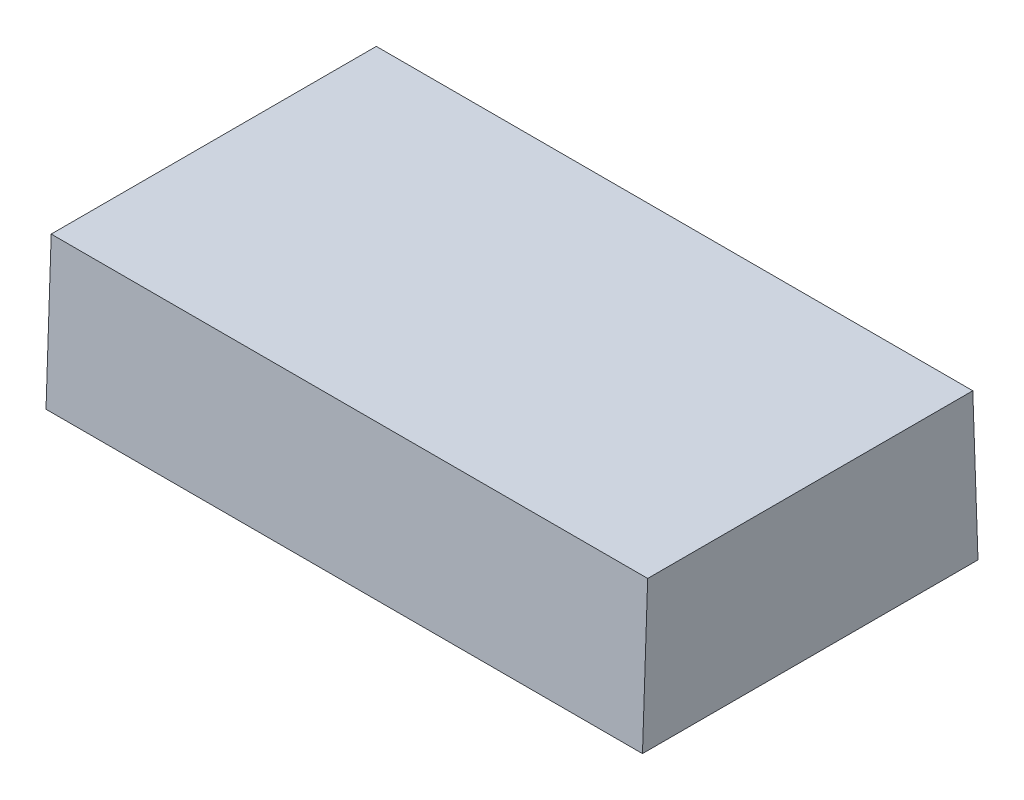
ISO-10303-21;
HEADER;
FILE_DESCRIPTION(('STEP AP214'),'2;1');
FILE_NAME('part.step','',(''),(''),'','','');
FILE_SCHEMA(('AUTOMOTIVE_DESIGN { 1 0 10303 214 1 1 1 1 }'));
ENDSEC;
DATA;
#1=APPLICATION_CONTEXT('core data for automotive mechanical design processes');
#2=APPLICATION_PROTOCOL_DEFINITION('international standard','automotive_design',2000,#1);
#3=PRODUCT_CONTEXT('',#1,'mechanical');
#4=PRODUCT('Part','Part','',(#3));
#5=PRODUCT_RELATED_PRODUCT_CATEGORY('part','',(#4));
#6=PRODUCT_DEFINITION_FORMATION('','',#4);
#7=PRODUCT_DEFINITION_CONTEXT('part definition',#1,'design');
#8=PRODUCT_DEFINITION('design','',#6,#7);
#9=PRODUCT_DEFINITION_SHAPE('','',#8);
#10=(LENGTH_UNIT() NAMED_UNIT(*) SI_UNIT(.MILLI.,.METRE.));
#11=(NAMED_UNIT(*) PLANE_ANGLE_UNIT() SI_UNIT($,.RADIAN.));
#12=(NAMED_UNIT(*) SI_UNIT($,.STERADIAN.) SOLID_ANGLE_UNIT());
#13=UNCERTAINTY_MEASURE_WITH_UNIT(LENGTH_MEASURE(1.E-05),#10,'distance_accuracy_value','');
#14=(GEOMETRIC_REPRESENTATION_CONTEXT(3) GLOBAL_UNCERTAINTY_ASSIGNED_CONTEXT((#13)) GLOBAL_UNIT_ASSIGNED_CONTEXT((#10,
#11,#12)) REPRESENTATION_CONTEXT('',''));
#15=CARTESIAN_POINT('',(0.,0.,0.));
#16=DIRECTION('',(0.,0.,1.));
#17=DIRECTION('',(1.,0.,0.));
#18=AXIS2_PLACEMENT_3D('',#15,#16,#17);
#19=CARTESIAN_POINT('',(203.2,50.8,-1.77397509018057));
#20=DIRECTION('',(0.,-0.0348994967024967,-0.999390827019096));
#21=DIRECTION('',(0.,0.999390827019096,-0.0348994967024967));
#22=AXIS2_PLACEMENT_3D('',#19,#20,#21);
#23=PLANE('',#22);
#24=DIRECTION('',(0.,-0.999390827019096,0.0348994967024967));
#25=VECTOR('',#24,1.);
#26=CARTESIAN_POINT('',(0.,50.8,-1.77397509018057));
#27=LINE('',#26,#25);
#28=CARTESIAN_POINT('',(0.,50.8,-1.77397509018057));
#29=VERTEX_POINT('',#28);
#30=CARTESIAN_POINT('',(0.,0.,0.));
#31=VERTEX_POINT('',#30);
#32=EDGE_CURVE('E142',#29,#31,#27,.T.);
#33=ORIENTED_EDGE('',*,*,#32,.T.);
#34=DIRECTION('',(-1.,0.,0.));
#35=VECTOR('',#34,1.);
#36=CARTESIAN_POINT('',(203.2,0.,0.));
#37=LINE('',#36,#35);
#38=CARTESIAN_POINT('',(203.2,0.,0.));
#39=VERTEX_POINT('',#38);
#40=EDGE_CURVE('E11',#39,#31,#37,.T.);
#41=ORIENTED_EDGE('',*,*,#40,.F.);
#42=DIRECTION('',(0.,-0.999390827019096,0.0348994967024967));
#43=VECTOR('',#42,1.);
#44=CARTESIAN_POINT('',(203.2,50.8,-1.77397509018057));
#45=LINE('',#44,#43);
#46=CARTESIAN_POINT('',(203.2,50.8,-1.77397509018057));
#47=VERTEX_POINT('',#46);
#48=EDGE_CURVE('E154',#47,#39,#45,.T.);
#49=ORIENTED_EDGE('',*,*,#48,.F.);
#50=DIRECTION('',(-1.,0.,0.));
#51=VECTOR('',#50,1.);
#52=CARTESIAN_POINT('',(203.2,50.8,-1.77397509018057));
#53=LINE('',#52,#51);
#54=EDGE_CURVE('E163',#47,#29,#53,.T.);
#55=ORIENTED_EDGE('',*,*,#54,.T.);
#56=EDGE_LOOP('',(#33,#41,#49,#55));
#57=FACE_BOUND('',#56,.T.);
#58=ADVANCED_FACE('F40',(#57),#23,.F.);
#59=CARTESIAN_POINT('',(203.2,0.,0.));
#60=DIRECTION('',(0.,1.,0.));
#61=DIRECTION('',(0.,0.,1.));
#62=AXIS2_PLACEMENT_3D('',#59,#60,#61);
#63=PLANE('',#62);
#64=DIRECTION('',(0.,0.,-1.));
#65=VECTOR('',#64,1.);
#66=CARTESIAN_POINT('',(0.,0.,0.));
#67=LINE('',#66,#65);
#68=CARTESIAN_POINT('',(0.,0.,-114.3));
#69=VERTEX_POINT('',#68);
#70=EDGE_CURVE('E148',#31,#69,#67,.T.);
#71=ORIENTED_EDGE('',*,*,#70,.T.);
#72=DIRECTION('',(-1.,0.,0.));
#73=VECTOR('',#72,1.);
#74=CARTESIAN_POINT('',(203.2,0.,-114.3));
#75=LINE('',#74,#73);
#76=CARTESIAN_POINT('',(203.2,0.,-114.3));
#77=VERTEX_POINT('',#76);
#78=EDGE_CURVE('E49',#77,#69,#75,.T.);
#79=ORIENTED_EDGE('',*,*,#78,.F.);
#80=DIRECTION('',(0.,0.,-1.));
#81=VECTOR('',#80,1.);
#82=CARTESIAN_POINT('',(203.2,0.,0.));
#83=LINE('',#82,#81);
#84=EDGE_CURVE('E88',#39,#77,#83,.T.);
#85=ORIENTED_EDGE('',*,*,#84,.F.);
#86=ORIENTED_EDGE('',*,*,#40,.T.);
#87=EDGE_LOOP('',(#71,#79,#85,#86));
#88=FACE_BOUND('',#87,.T.);
#89=ADVANCED_FACE('F193',(#88),#63,.F.);
#90=CARTESIAN_POINT('',(203.2,0.,-114.3));
#91=DIRECTION('',(0.,-0.0348994967024975,0.999390827019096));
#92=DIRECTION('',(0.,-0.999390827019096,-0.0348994967024975));
#93=AXIS2_PLACEMENT_3D('',#90,#91,#92);
#94=PLANE('',#93);
#95=DIRECTION('',(0.,0.999390827019096,0.0348994967024975));
#96=VECTOR('',#95,1.);
#97=CARTESIAN_POINT('',(0.,0.,-114.3));
#98=LINE('',#97,#96);
#99=CARTESIAN_POINT('',(0.,50.8,-112.526024909819));
#100=VERTEX_POINT('',#99);
#101=EDGE_CURVE('E75',#69,#100,#98,.T.);
#102=ORIENTED_EDGE('',*,*,#101,.T.);
#103=DIRECTION('',(-1.,0.,0.));
#104=VECTOR('',#103,1.);
#105=CARTESIAN_POINT('',(203.2,50.8,-112.526024909819));
#106=LINE('',#105,#104);
#107=CARTESIAN_POINT('',(203.2,50.8,-112.526024909819));
#108=VERTEX_POINT('',#107);
#109=EDGE_CURVE('E173',#108,#100,#106,.T.);
#110=ORIENTED_EDGE('',*,*,#109,.F.);
#111=DIRECTION('',(0.,0.999390827019096,0.0348994967024975));
#112=VECTOR('',#111,1.);
#113=CARTESIAN_POINT('',(203.2,0.,-114.3));
#114=LINE('',#113,#112);
#115=EDGE_CURVE('E159',#77,#108,#114,.T.);
#116=ORIENTED_EDGE('',*,*,#115,.F.);
#117=ORIENTED_EDGE('',*,*,#78,.T.);
#118=EDGE_LOOP('',(#102,#110,#116,#117));
#119=FACE_BOUND('',#118,.T.);
#120=ADVANCED_FACE('F177',(#119),#94,.F.);
#121=CARTESIAN_POINT('',(203.2,50.8,-112.526024909819));
#122=DIRECTION('',(0.,-1.,0.));
#123=DIRECTION('',(0.,0.,-1.));
#124=AXIS2_PLACEMENT_3D('',#121,#122,#123);
#125=PLANE('',#124);
#126=DIRECTION('',(0.,0.,1.));
#127=VECTOR('',#126,1.);
#128=CARTESIAN_POINT('',(0.,50.8,-112.526024909819));
#129=LINE('',#128,#127);
#130=EDGE_CURVE('E81',#100,#29,#129,.T.);
#131=ORIENTED_EDGE('',*,*,#130,.T.);
#132=ORIENTED_EDGE('',*,*,#54,.F.);
#133=DIRECTION('',(0.,0.,1.));
#134=VECTOR('',#133,1.);
#135=CARTESIAN_POINT('',(203.2,50.8,-112.526024909819));
#136=LINE('',#135,#134);
#137=EDGE_CURVE('E57',#108,#47,#136,.T.);
#138=ORIENTED_EDGE('',*,*,#137,.F.);
#139=ORIENTED_EDGE('',*,*,#109,.T.);
#140=EDGE_LOOP('',(#131,#132,#138,#139));
#141=FACE_BOUND('',#140,.T.);
#142=ADVANCED_FACE('F184',(#141),#125,.F.);
#143=CARTESIAN_POINT('',(203.2,0.,0.));
#144=DIRECTION('',(1.,0.,0.));
#145=DIRECTION('',(0.,0.,-1.));
#146=AXIS2_PLACEMENT_3D('',#143,#144,#145);
#147=PLANE('',#146);
#148=ORIENTED_EDGE('',*,*,#48,.T.);
#149=ORIENTED_EDGE('',*,*,#84,.T.);
#150=ORIENTED_EDGE('',*,*,#115,.T.);
#151=ORIENTED_EDGE('',*,*,#137,.T.);
#152=EDGE_LOOP('',(#148,#149,#150,#151));
#153=FACE_BOUND('',#152,.T.);
#154=ADVANCED_FACE('F186',(#153),#147,.T.);
#155=CARTESIAN_POINT('',(0.,0.,0.));
#156=DIRECTION('',(1.,0.,0.));
#157=DIRECTION('',(0.,0.,-1.));
#158=AXIS2_PLACEMENT_3D('',#155,#156,#157);
#159=PLANE('',#158);
#160=ORIENTED_EDGE('',*,*,#32,.F.);
#161=ORIENTED_EDGE('',*,*,#130,.F.);
#162=ORIENTED_EDGE('',*,*,#101,.F.);
#163=ORIENTED_EDGE('',*,*,#70,.F.);
#164=EDGE_LOOP('',(#160,#161,#162,#163));
#165=FACE_BOUND('',#164,.T.);
#166=ADVANCED_FACE('F180',(#165),#159,.F.);
#167=CLOSED_SHELL('',(#58,#89,#120,#142,#154,#166));
#168=CARTESIAN_POINT('',(192.405,9.525,-9.86342623885513));
#169=DIRECTION('',(0.,1.,0.));
#170=DIRECTION('',(0.,0.,1.));
#171=AXIS2_PLACEMENT_3D('',#168,#169,#170);
#172=PLANE('',#171);
#173=DIRECTION('',(0.,0.,-1.));
#174=VECTOR('',#173,1.);
#175=CARTESIAN_POINT('',(9.525,9.525,-9.86342623885513));
#176=LINE('',#175,#174);
#177=CARTESIAN_POINT('',(9.525,9.525,-9.86342623885513));
#178=VERTEX_POINT('',#177);
#179=CARTESIAN_POINT('',(9.525,9.525,-103.84766882559));
#180=VERTEX_POINT('',#179);
#181=EDGE_CURVE('E283',#178,#180,#176,.T.);
#182=ORIENTED_EDGE('',*,*,#181,.F.);
#183=DIRECTION('',(-1.,0.,0.));
#184=VECTOR('',#183,1.);
#185=CARTESIAN_POINT('',(192.405,9.525,-9.86342623885513));
#186=LINE('',#185,#184);
#187=CARTESIAN_POINT('',(192.405,9.525,-9.86342623885513));
#188=VERTEX_POINT('',#187);
#189=EDGE_CURVE('E135',#188,#178,#186,.T.);
#190=ORIENTED_EDGE('',*,*,#189,.F.);
#191=DIRECTION('',(0.,0.,-1.));
#192=VECTOR('',#191,1.);
#193=CARTESIAN_POINT('',(192.405,9.525,-9.86342623885513));
#194=LINE('',#193,#192);
#195=CARTESIAN_POINT('',(192.405,9.525,-103.84766882559));
#196=VERTEX_POINT('',#195);
#197=EDGE_CURVE('E119',#188,#196,#194,.T.);
#198=ORIENTED_EDGE('',*,*,#197,.T.);
#199=DIRECTION('',(-1.,0.,0.));
#200=VECTOR('',#199,1.);
#201=CARTESIAN_POINT('',(192.405,9.525,-103.84766882559));
#202=LINE('',#201,#200);
#203=EDGE_CURVE('E132',#196,#180,#202,.T.);
#204=ORIENTED_EDGE('',*,*,#203,.T.);
#205=EDGE_LOOP('',(#182,#190,#198,#204));
#206=FACE_BOUND('',#205,.T.);
#207=ADVANCED_FACE('F131',(#206),#172,.T.);
#208=CARTESIAN_POINT('',(192.405,9.525,-103.84766882559));
#209=DIRECTION('',(0.,-0.0348994967024974,0.999390827019096));
#210=DIRECTION('',(0.,-0.999390827019096,-0.0348994967024974));
#211=AXIS2_PLACEMENT_3D('',#208,#209,#210);
#212=PLANE('',#211);
#213=DIRECTION('',(0.,0.999390827019096,0.0348994967024974));
#214=VECTOR('',#213,1.);
#215=CARTESIAN_POINT('',(9.525,9.525,-103.84766882559));
#216=LINE('',#215,#214);
#217=CARTESIAN_POINT('',(9.525,41.275,-102.738934394227));
#218=VERTEX_POINT('',#217);
#219=EDGE_CURVE('E140',#180,#218,#216,.T.);
#220=ORIENTED_EDGE('',*,*,#219,.F.);
#221=ORIENTED_EDGE('',*,*,#203,.F.);
#222=DIRECTION('',(0.,0.999390827019096,0.0348994967024974));
#223=VECTOR('',#222,1.);
#224=CARTESIAN_POINT('',(192.405,9.525,-103.84766882559));
#225=LINE('',#224,#223);
#226=CARTESIAN_POINT('',(192.405,41.275,-102.738934394227));
#227=VERTEX_POINT('',#226);
#228=EDGE_CURVE('E115',#196,#227,#225,.T.);
#229=ORIENTED_EDGE('',*,*,#228,.T.);
#230=DIRECTION('',(-1.,0.,0.));
#231=VECTOR('',#230,1.);
#232=CARTESIAN_POINT('',(192.405,41.275,-102.738934394227));
#233=LINE('',#232,#231);
#234=EDGE_CURVE('E143',#227,#218,#233,.T.);
#235=ORIENTED_EDGE('',*,*,#234,.T.);
#236=EDGE_LOOP('',(#220,#221,#229,#235));
#237=FACE_BOUND('',#236,.T.);
#238=ADVANCED_FACE('F139',(#237),#212,.T.);
#239=CARTESIAN_POINT('',(192.405,41.275,-102.738934394227));
#240=DIRECTION('',(0.,-1.,0.));
#241=DIRECTION('',(0.,0.,-1.));
#242=AXIS2_PLACEMENT_3D('',#239,#240,#241);
#243=PLANE('',#242);
#244=DIRECTION('',(0.,0.,1.));
#245=VECTOR('',#244,1.);
#246=CARTESIAN_POINT('',(9.525,41.275,-102.738934394227));
#247=LINE('',#246,#245);
#248=CARTESIAN_POINT('',(9.525,41.275,-10.972160670218));
#249=VERTEX_POINT('',#248);
#250=EDGE_CURVE('E288',#218,#249,#247,.T.);
#251=ORIENTED_EDGE('',*,*,#250,.F.);
#252=ORIENTED_EDGE('',*,*,#234,.F.);
#253=DIRECTION('',(0.,0.,1.));
#254=VECTOR('',#253,1.);
#255=CARTESIAN_POINT('',(192.405,41.275,-102.738934394227));
#256=LINE('',#255,#254);
#257=CARTESIAN_POINT('',(192.405,41.275,-10.972160670218));
#258=VERTEX_POINT('',#257);
#259=EDGE_CURVE('E120',#227,#258,#256,.T.);
#260=ORIENTED_EDGE('',*,*,#259,.T.);
#261=DIRECTION('',(-1.,0.,0.));
#262=VECTOR('',#261,1.);
#263=CARTESIAN_POINT('',(192.405,41.275,-10.972160670218));
#264=LINE('',#263,#262);
#265=EDGE_CURVE('E150',#258,#249,#264,.T.);
#266=ORIENTED_EDGE('',*,*,#265,.T.);
#267=EDGE_LOOP('',(#251,#252,#260,#266));
#268=FACE_BOUND('',#267,.T.);
#269=ADVANCED_FACE('F241',(#268),#243,.T.);
#270=CARTESIAN_POINT('',(192.405,41.275,-10.972160670218));
#271=DIRECTION('',(0.,-0.0348994967024967,-0.999390827019096));
#272=DIRECTION('',(0.,0.999390827019096,-0.0348994967024967));
#273=AXIS2_PLACEMENT_3D('',#270,#271,#272);
#274=PLANE('',#273);
#275=DIRECTION('',(0.,-0.999390827019096,0.0348994967024967));
#276=VECTOR('',#275,1.);
#277=CARTESIAN_POINT('',(9.525,41.275,-10.972160670218));
#278=LINE('',#277,#276);
#279=EDGE_CURVE('E137',#249,#178,#278,.T.);
#280=ORIENTED_EDGE('',*,*,#279,.F.);
#281=ORIENTED_EDGE('',*,*,#265,.F.);
#282=DIRECTION('',(0.,-0.999390827019096,0.0348994967024967));
#283=VECTOR('',#282,1.);
#284=CARTESIAN_POINT('',(192.405,41.275,-10.972160670218));
#285=LINE('',#284,#283);
#286=EDGE_CURVE('E291',#258,#188,#285,.T.);
#287=ORIENTED_EDGE('',*,*,#286,.T.);
#288=ORIENTED_EDGE('',*,*,#189,.T.);
#289=EDGE_LOOP('',(#280,#281,#287,#288));
#290=FACE_BOUND('',#289,.T.);
#291=ADVANCED_FACE('F250',(#290),#274,.T.);
#292=CARTESIAN_POINT('',(192.405,0.,0.));
#293=DIRECTION('',(1.,0.,0.));
#294=DIRECTION('',(0.,0.,-1.));
#295=AXIS2_PLACEMENT_3D('',#292,#293,#294);
#296=PLANE('',#295);
#297=ORIENTED_EDGE('',*,*,#197,.F.);
#298=ORIENTED_EDGE('',*,*,#286,.F.);
#299=ORIENTED_EDGE('',*,*,#259,.F.);
#300=ORIENTED_EDGE('',*,*,#228,.F.);
#301=EDGE_LOOP('',(#297,#298,#299,#300));
#302=FACE_BOUND('',#301,.T.);
#303=ADVANCED_FACE('F117',(#302),#296,.F.);
#304=CARTESIAN_POINT('',(9.525,0.,0.));
#305=DIRECTION('',(1.,0.,0.));
#306=DIRECTION('',(0.,0.,-1.));
#307=AXIS2_PLACEMENT_3D('',#304,#305,#306);
#308=PLANE('',#307);
#309=ORIENTED_EDGE('',*,*,#181,.T.);
#310=ORIENTED_EDGE('',*,*,#219,.T.);
#311=ORIENTED_EDGE('',*,*,#250,.T.);
#312=ORIENTED_EDGE('',*,*,#279,.T.);
#313=EDGE_LOOP('',(#309,#310,#311,#312));
#314=FACE_BOUND('',#313,.T.);
#315=ADVANCED_FACE('F269',(#314),#308,.T.);
#316=CLOSED_SHELL('',(#207,#238,#269,#291,#303,#315));
#317=ORIENTED_CLOSED_SHELL('',*,#316,.T.);
#318=BREP_WITH_VOIDS('B2',#167,(#317));
#319=ADVANCED_BREP_SHAPE_REPRESENTATION('',(#18,#318),#14);
#320=SHAPE_DEFINITION_REPRESENTATION(#9,#319);
ENDSEC;
END-ISO-10303-21;
